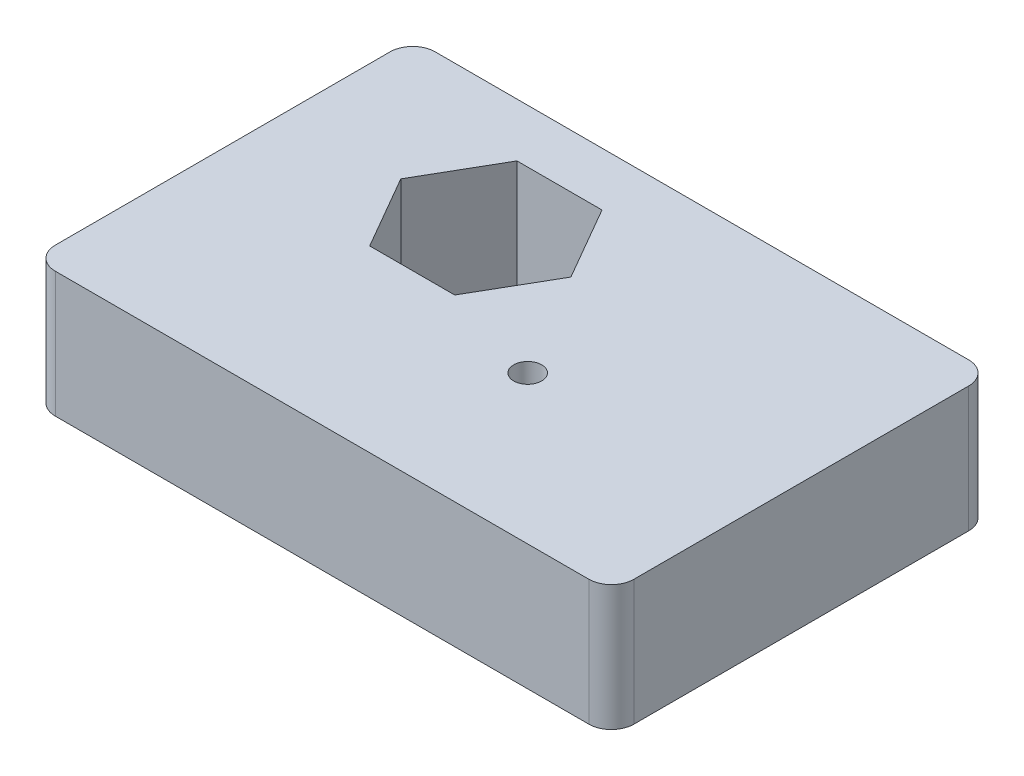
ISO-10303-21;
HEADER;
FILE_DESCRIPTION(('STEP AP214'),'2;1');
FILE_NAME('part.step','',(''),(''),'','','');
FILE_SCHEMA(('AUTOMOTIVE_DESIGN { 1 0 10303 214 1 1 1 1 }'));
ENDSEC;
DATA;
#1=APPLICATION_CONTEXT('core data for automotive mechanical design processes');
#2=APPLICATION_PROTOCOL_DEFINITION('international standard','automotive_design',2000,#1);
#3=PRODUCT_CONTEXT('',#1,'mechanical');
#4=PRODUCT('Part','Part','',(#3));
#5=PRODUCT_RELATED_PRODUCT_CATEGORY('part','',(#4));
#6=PRODUCT_DEFINITION_FORMATION('','',#4);
#7=PRODUCT_DEFINITION_CONTEXT('part definition',#1,'design');
#8=PRODUCT_DEFINITION('design','',#6,#7);
#9=PRODUCT_DEFINITION_SHAPE('','',#8);
#10=(LENGTH_UNIT() NAMED_UNIT(*) SI_UNIT(.MILLI.,.METRE.));
#11=(NAMED_UNIT(*) PLANE_ANGLE_UNIT() SI_UNIT($,.RADIAN.));
#12=(NAMED_UNIT(*) SI_UNIT($,.STERADIAN.) SOLID_ANGLE_UNIT());
#13=UNCERTAINTY_MEASURE_WITH_UNIT(LENGTH_MEASURE(1.E-05),#10,'distance_accuracy_value','');
#14=(GEOMETRIC_REPRESENTATION_CONTEXT(3) GLOBAL_UNCERTAINTY_ASSIGNED_CONTEXT((#13)) GLOBAL_UNIT_ASSIGNED_CONTEXT((#10,
#11,#12)) REPRESENTATION_CONTEXT('',''));
#15=CARTESIAN_POINT('',(0.,0.,0.));
#16=DIRECTION('',(0.,0.,1.));
#17=DIRECTION('',(1.,0.,0.));
#18=AXIS2_PLACEMENT_3D('',#15,#16,#17);
#19=CARTESIAN_POINT('',(0.,6.,0.));
#20=DIRECTION('',(0.,-1.,0.));
#21=DIRECTION('',(0.,0.,-1.));
#22=AXIS2_PLACEMENT_3D('',#19,#20,#21);
#23=PLANE('',#22);
#24=CARTESIAN_POINT('',(16.5,6.,-7.));
#25=DIRECTION('',(0.,-1.,0.));
#26=DIRECTION('',(0.,0.,-1.));
#27=AXIS2_PLACEMENT_3D('',#24,#25,#26);
#28=CIRCLE('',#27,0.670000000000002);
#29=CARTESIAN_POINT('',(16.5,6.,-7.67));
#30=VERTEX_POINT('',#29);
#31=EDGE_CURVE('E206',#30,#30,#28,.F.);
#32=ORIENTED_EDGE('',*,*,#31,.F.);
#33=EDGE_LOOP('',(#32));
#34=FACE_BOUND('',#33,.T.);
#35=DIRECTION('',(0.,0.,1.));
#36=VECTOR('',#35,1.);
#37=CARTESIAN_POINT('',(-0.08,6.,0.));
#38=LINE('',#37,#36);
#39=CARTESIAN_POINT('',(-0.08,6.,-17.));
#40=VERTEX_POINT('',#39);
#41=CARTESIAN_POINT('',(-0.08,6.,-1.));
#42=VERTEX_POINT('',#41);
#43=EDGE_CURVE('E200',#40,#42,#38,.T.);
#44=ORIENTED_EDGE('',*,*,#43,.T.);
#45=CARTESIAN_POINT('',(1.,6.,-1.));
#46=DIRECTION('',(0.,-1.,0.));
#47=DIRECTION('',(0.,0.,-1.));
#48=AXIS2_PLACEMENT_3D('',#45,#46,#47);
#49=CIRCLE('',#48,1.08);
#50=CARTESIAN_POINT('',(1.,6.,0.08));
#51=VERTEX_POINT('',#50);
#52=EDGE_CURVE('E217',#42,#51,#49,.F.);
#53=ORIENTED_EDGE('',*,*,#52,.T.);
#54=DIRECTION('',(1.,0.,0.));
#55=VECTOR('',#54,1.);
#56=CARTESIAN_POINT('',(0.,6.,0.08));
#57=LINE('',#56,#55);
#58=CARTESIAN_POINT('',(26.5,6.,0.08));
#59=VERTEX_POINT('',#58);
#60=EDGE_CURVE('E213',#51,#59,#57,.T.);
#61=ORIENTED_EDGE('',*,*,#60,.T.);
#62=CARTESIAN_POINT('',(26.5,6.,-1.));
#63=DIRECTION('',(0.,-1.,0.));
#64=DIRECTION('',(0.,0.,-1.));
#65=AXIS2_PLACEMENT_3D('',#62,#63,#64);
#66=CIRCLE('',#65,1.08);
#67=CARTESIAN_POINT('',(27.58,6.,-1.));
#68=VERTEX_POINT('',#67);
#69=EDGE_CURVE('E229',#59,#68,#66,.F.);
#70=ORIENTED_EDGE('',*,*,#69,.T.);
#71=DIRECTION('',(0.,0.,-1.));
#72=VECTOR('',#71,1.);
#73=CARTESIAN_POINT('',(27.58,6.,0.));
#74=LINE('',#73,#72);
#75=CARTESIAN_POINT('',(27.58,6.,-17.));
#76=VERTEX_POINT('',#75);
#77=EDGE_CURVE('E216',#68,#76,#74,.T.);
#78=ORIENTED_EDGE('',*,*,#77,.T.);
#79=CARTESIAN_POINT('',(26.5,6.,-17.));
#80=DIRECTION('',(0.,-1.,0.));
#81=DIRECTION('',(0.,0.,-1.));
#82=AXIS2_PLACEMENT_3D('',#79,#80,#81);
#83=CIRCLE('',#82,1.08);
#84=CARTESIAN_POINT('',(26.5,6.,-18.08));
#85=VERTEX_POINT('',#84);
#86=EDGE_CURVE('E224',#76,#85,#83,.F.);
#87=ORIENTED_EDGE('',*,*,#86,.T.);
#88=DIRECTION('',(-1.,0.,0.));
#89=VECTOR('',#88,1.);
#90=CARTESIAN_POINT('',(0.,6.,-18.08));
#91=LINE('',#90,#89);
#92=CARTESIAN_POINT('',(1.,6.,-18.08));
#93=VERTEX_POINT('',#92);
#94=EDGE_CURVE('E225',#85,#93,#91,.T.);
#95=ORIENTED_EDGE('',*,*,#94,.T.);
#96=CARTESIAN_POINT('',(1.,6.,-17.));
#97=DIRECTION('',(0.,-1.,0.));
#98=DIRECTION('',(0.,0.,-1.));
#99=AXIS2_PLACEMENT_3D('',#96,#97,#98);
#100=CIRCLE('',#99,1.08);
#101=EDGE_CURVE('E220',#93,#40,#100,.F.);
#102=ORIENTED_EDGE('',*,*,#101,.T.);
#103=EDGE_LOOP('',(#44,#53,#61,#70,#78,#87,#95,#102));
#104=FACE_BOUND('',#103,.T.);
#105=DIRECTION('',(0.5,0.,-0.866025403784439));
#106=VECTOR('',#105,1.);
#107=CARTESIAN_POINT('',(4.97725699861459,6.,2.87362066797608));
#108=LINE('',#107,#106);
#109=CARTESIAN_POINT('',(11.5322729475475,6.,-8.48));
#110=VERTEX_POINT('',#109);
#111=CARTESIAN_POINT('',(13.564545895095,6.,-12.));
#112=VERTEX_POINT('',#111);
#113=EDGE_CURVE('E145',#110,#112,#108,.T.);
#114=ORIENTED_EDGE('',*,*,#113,.F.);
#115=DIRECTION('',(1.,0.,0.));
#116=VECTOR('',#115,1.);
#117=CARTESIAN_POINT('',(0.,6.,-8.48));
#118=LINE('',#117,#116);
#119=CARTESIAN_POINT('',(7.46772705245251,6.,-8.48));
#120=VERTEX_POINT('',#119);
#121=EDGE_CURVE('E160',#120,#110,#118,.T.);
#122=ORIENTED_EDGE('',*,*,#121,.F.);
#123=DIRECTION('',(0.5,0.,0.866025403784439));
#124=VECTOR('',#123,1.);
#125=CARTESIAN_POINT('',(9.2727430013854,6.,-5.35362066797608));
#126=LINE('',#125,#124);
#127=CARTESIAN_POINT('',(5.43545410490503,6.,-12.));
#128=VERTEX_POINT('',#127);
#129=EDGE_CURVE('E156',#128,#120,#126,.T.);
#130=ORIENTED_EDGE('',*,*,#129,.F.);
#131=DIRECTION('',(-0.5,0.,0.866025403784439));
#132=VECTOR('',#131,1.);
#133=CARTESIAN_POINT('',(-1.11956184402786,6.,-0.646379332023917));
#134=LINE('',#133,#132);
#135=CARTESIAN_POINT('',(7.46772705245252,6.,-15.52));
#136=VERTEX_POINT('',#135);
#137=EDGE_CURVE('E155',#136,#128,#134,.T.);
#138=ORIENTED_EDGE('',*,*,#137,.F.);
#139=DIRECTION('',(-1.,0.,0.));
#140=VECTOR('',#139,1.);
#141=CARTESIAN_POINT('',(0.,6.,-15.52));
#142=LINE('',#141,#140);
#143=CARTESIAN_POINT('',(11.5322729475475,6.,-15.52));
#144=VERTEX_POINT('',#143);
#145=EDGE_CURVE('E39',#144,#136,#142,.T.);
#146=ORIENTED_EDGE('',*,*,#145,.F.);
#147=DIRECTION('',(-0.5,0.,-0.866025403784439));
#148=VECTOR('',#147,1.);
#149=CARTESIAN_POINT('',(15.3695618440279,6.,-8.87362066797607));
#150=LINE('',#149,#148);
#151=EDGE_CURVE('E137',#112,#144,#150,.T.);
#152=ORIENTED_EDGE('',*,*,#151,.F.);
#153=EDGE_LOOP('',(#114,#122,#130,#138,#146,#152));
#154=FACE_BOUND('',#153,.T.);
#155=ADVANCED_FACE('F35',(#34,#104,#154),#23,.F.);
#156=CARTESIAN_POINT('',(0.,0.,0.));
#157=DIRECTION('',(0.,-1.,0.));
#158=DIRECTION('',(0.,0.,-1.));
#159=AXIS2_PLACEMENT_3D('',#156,#157,#158);
#160=PLANE('',#159);
#161=CARTESIAN_POINT('',(16.5,0.,-7.));
#162=DIRECTION('',(0.,-1.,0.));
#163=DIRECTION('',(0.,0.,-1.));
#164=AXIS2_PLACEMENT_3D('',#161,#162,#163);
#165=CIRCLE('',#164,0.670000000000002);
#166=CARTESIAN_POINT('',(16.5,0.,-7.67));
#167=VERTEX_POINT('',#166);
#168=EDGE_CURVE('E189',#167,#167,#165,.F.);
#169=ORIENTED_EDGE('',*,*,#168,.T.);
#170=EDGE_LOOP('',(#169));
#171=FACE_BOUND('',#170,.T.);
#172=DIRECTION('',(1.,0.,0.));
#173=VECTOR('',#172,1.);
#174=CARTESIAN_POINT('',(0.,0.,0.08));
#175=LINE('',#174,#173);
#176=CARTESIAN_POINT('',(1.,0.,0.08));
#177=VERTEX_POINT('',#176);
#178=CARTESIAN_POINT('',(26.5,0.,0.08));
#179=VERTEX_POINT('',#178);
#180=EDGE_CURVE('E194',#177,#179,#175,.T.);
#181=ORIENTED_EDGE('',*,*,#180,.F.);
#182=CARTESIAN_POINT('',(1.,0.,-1.));
#183=DIRECTION('',(0.,-1.,0.));
#184=DIRECTION('',(0.,0.,-1.));
#185=AXIS2_PLACEMENT_3D('',#182,#183,#184);
#186=CIRCLE('',#185,1.08);
#187=CARTESIAN_POINT('',(-0.08,0.,-1.));
#188=VERTEX_POINT('',#187);
#189=EDGE_CURVE('E202',#177,#188,#186,.T.);
#190=ORIENTED_EDGE('',*,*,#189,.T.);
#191=DIRECTION('',(0.,0.,1.));
#192=VECTOR('',#191,1.);
#193=CARTESIAN_POINT('',(-0.08,0.,0.));
#194=LINE('',#193,#192);
#195=CARTESIAN_POINT('',(-0.08,0.,-17.));
#196=VERTEX_POINT('',#195);
#197=EDGE_CURVE('E203',#196,#188,#194,.T.);
#198=ORIENTED_EDGE('',*,*,#197,.F.);
#199=CARTESIAN_POINT('',(1.,0.,-17.));
#200=DIRECTION('',(0.,-1.,0.));
#201=DIRECTION('',(0.,0.,-1.));
#202=AXIS2_PLACEMENT_3D('',#199,#200,#201);
#203=CIRCLE('',#202,1.08);
#204=CARTESIAN_POINT('',(1.,0.,-18.08));
#205=VERTEX_POINT('',#204);
#206=EDGE_CURVE('E197',#196,#205,#203,.T.);
#207=ORIENTED_EDGE('',*,*,#206,.T.);
#208=DIRECTION('',(-1.,0.,0.));
#209=VECTOR('',#208,1.);
#210=CARTESIAN_POINT('',(0.,0.,-18.08));
#211=LINE('',#210,#209);
#212=CARTESIAN_POINT('',(26.5,0.,-18.08));
#213=VERTEX_POINT('',#212);
#214=EDGE_CURVE('E193',#213,#205,#211,.T.);
#215=ORIENTED_EDGE('',*,*,#214,.F.);
#216=CARTESIAN_POINT('',(26.5,0.,-17.));
#217=DIRECTION('',(0.,-1.,0.));
#218=DIRECTION('',(0.,0.,-1.));
#219=AXIS2_PLACEMENT_3D('',#216,#217,#218);
#220=CIRCLE('',#219,1.08);
#221=CARTESIAN_POINT('',(27.58,0.,-17.));
#222=VERTEX_POINT('',#221);
#223=EDGE_CURVE('E195',#213,#222,#220,.T.);
#224=ORIENTED_EDGE('',*,*,#223,.T.);
#225=DIRECTION('',(0.,0.,-1.));
#226=VECTOR('',#225,1.);
#227=CARTESIAN_POINT('',(27.58,0.,0.));
#228=LINE('',#227,#226);
#229=CARTESIAN_POINT('',(27.58,0.,-1.));
#230=VERTEX_POINT('',#229);
#231=EDGE_CURVE('E190',#230,#222,#228,.T.);
#232=ORIENTED_EDGE('',*,*,#231,.F.);
#233=CARTESIAN_POINT('',(26.5,0.,-1.));
#234=DIRECTION('',(0.,-1.,0.));
#235=DIRECTION('',(0.,0.,-1.));
#236=AXIS2_PLACEMENT_3D('',#233,#234,#235);
#237=CIRCLE('',#236,1.08);
#238=EDGE_CURVE('E198',#230,#179,#237,.T.);
#239=ORIENTED_EDGE('',*,*,#238,.T.);
#240=EDGE_LOOP('',(#181,#190,#198,#207,#215,#224,#232,#239));
#241=FACE_BOUND('',#240,.T.);
#242=DIRECTION('',(1.,0.,0.));
#243=VECTOR('',#242,1.);
#244=CARTESIAN_POINT('',(0.,0.,-8.48));
#245=LINE('',#244,#243);
#246=CARTESIAN_POINT('',(7.46772705245251,0.,-8.48));
#247=VERTEX_POINT('',#246);
#248=CARTESIAN_POINT('',(11.5322729475475,0.,-8.48));
#249=VERTEX_POINT('',#248);
#250=EDGE_CURVE('E165',#247,#249,#245,.T.);
#251=ORIENTED_EDGE('',*,*,#250,.T.);
#252=DIRECTION('',(0.5,0.,-0.866025403784439));
#253=VECTOR('',#252,1.);
#254=CARTESIAN_POINT('',(4.97725699861459,0.,2.87362066797608));
#255=LINE('',#254,#253);
#256=CARTESIAN_POINT('',(13.564545895095,0.,-12.));
#257=VERTEX_POINT('',#256);
#258=EDGE_CURVE('E167',#249,#257,#255,.T.);
#259=ORIENTED_EDGE('',*,*,#258,.T.);
#260=DIRECTION('',(-0.5,0.,-0.866025403784439));
#261=VECTOR('',#260,1.);
#262=CARTESIAN_POINT('',(15.3695618440279,0.,-8.87362066797607));
#263=LINE('',#262,#261);
#264=CARTESIAN_POINT('',(11.5322729475475,0.,-15.52));
#265=VERTEX_POINT('',#264);
#266=EDGE_CURVE('E170',#257,#265,#263,.T.);
#267=ORIENTED_EDGE('',*,*,#266,.T.);
#268=DIRECTION('',(-1.,0.,0.));
#269=VECTOR('',#268,1.);
#270=CARTESIAN_POINT('',(0.,0.,-15.52));
#271=LINE('',#270,#269);
#272=CARTESIAN_POINT('',(7.46772705245252,0.,-15.52));
#273=VERTEX_POINT('',#272);
#274=EDGE_CURVE('E149',#265,#273,#271,.T.);
#275=ORIENTED_EDGE('',*,*,#274,.T.);
#276=DIRECTION('',(-0.5,0.,0.866025403784439));
#277=VECTOR('',#276,1.);
#278=CARTESIAN_POINT('',(-1.11956184402786,0.,-0.646379332023917));
#279=LINE('',#278,#277);
#280=CARTESIAN_POINT('',(5.43545410490503,0.,-12.));
#281=VERTEX_POINT('',#280);
#282=EDGE_CURVE('E176',#273,#281,#279,.T.);
#283=ORIENTED_EDGE('',*,*,#282,.T.);
#284=DIRECTION('',(0.5,0.,0.866025403784439));
#285=VECTOR('',#284,1.);
#286=CARTESIAN_POINT('',(9.2727430013854,0.,-5.35362066797608));
#287=LINE('',#286,#285);
#288=EDGE_CURVE('E173',#281,#247,#287,.T.);
#289=ORIENTED_EDGE('',*,*,#288,.T.);
#290=EDGE_LOOP('',(#251,#259,#267,#275,#283,#289));
#291=FACE_BOUND('',#290,.T.);
#292=ADVANCED_FACE('F256',(#171,#241,#291),#160,.T.);
#293=CARTESIAN_POINT('',(-0.08,6.,0.));
#294=DIRECTION('',(1.,0.,0.));
#295=DIRECTION('',(0.,0.,-1.));
#296=AXIS2_PLACEMENT_3D('',#293,#294,#295);
#297=PLANE('',#296);
#298=ORIENTED_EDGE('',*,*,#197,.T.);
#299=DIRECTION('',(0.,1.,0.));
#300=VECTOR('',#299,1.);
#301=CARTESIAN_POINT('',(-0.08,6.,-1.));
#302=LINE('',#301,#300);
#303=EDGE_CURVE('E234',#188,#42,#302,.T.);
#304=ORIENTED_EDGE('',*,*,#303,.T.);
#305=ORIENTED_EDGE('',*,*,#43,.F.);
#306=DIRECTION('',(0.,1.,0.));
#307=VECTOR('',#306,1.);
#308=CARTESIAN_POINT('',(-0.08,6.,-17.));
#309=LINE('',#308,#307);
#310=EDGE_CURVE('E208',#40,#196,#309,.F.);
#311=ORIENTED_EDGE('',*,*,#310,.T.);
#312=EDGE_LOOP('',(#298,#304,#305,#311));
#313=FACE_BOUND('',#312,.T.);
#314=ADVANCED_FACE('F293',(#313),#297,.F.);
#315=CARTESIAN_POINT('',(0.,6.,0.08));
#316=DIRECTION('',(0.,0.,-1.));
#317=DIRECTION('',(-1.,0.,0.));
#318=AXIS2_PLACEMENT_3D('',#315,#316,#317);
#319=PLANE('',#318);
#320=ORIENTED_EDGE('',*,*,#60,.F.);
#321=DIRECTION('',(0.,1.,0.));
#322=VECTOR('',#321,1.);
#323=CARTESIAN_POINT('',(1.,6.,0.08));
#324=LINE('',#323,#322);
#325=EDGE_CURVE('E212',#51,#177,#324,.F.);
#326=ORIENTED_EDGE('',*,*,#325,.T.);
#327=ORIENTED_EDGE('',*,*,#180,.T.);
#328=DIRECTION('',(0.,1.,0.));
#329=VECTOR('',#328,1.);
#330=CARTESIAN_POINT('',(26.5,6.,0.08));
#331=LINE('',#330,#329);
#332=EDGE_CURVE('E227',#179,#59,#331,.T.);
#333=ORIENTED_EDGE('',*,*,#332,.T.);
#334=EDGE_LOOP('',(#320,#326,#327,#333));
#335=FACE_BOUND('',#334,.T.);
#336=ADVANCED_FACE('F270',(#335),#319,.F.);
#337=CARTESIAN_POINT('',(27.58,6.,0.));
#338=DIRECTION('',(-1.,0.,0.));
#339=DIRECTION('',(0.,0.,1.));
#340=AXIS2_PLACEMENT_3D('',#337,#338,#339);
#341=PLANE('',#340);
#342=ORIENTED_EDGE('',*,*,#231,.T.);
#343=DIRECTION('',(0.,1.,0.));
#344=VECTOR('',#343,1.);
#345=CARTESIAN_POINT('',(27.58,6.,-17.));
#346=LINE('',#345,#344);
#347=EDGE_CURVE('E12',#222,#76,#346,.T.);
#348=ORIENTED_EDGE('',*,*,#347,.T.);
#349=ORIENTED_EDGE('',*,*,#77,.F.);
#350=DIRECTION('',(0.,1.,0.));
#351=VECTOR('',#350,1.);
#352=CARTESIAN_POINT('',(27.58,6.,-1.));
#353=LINE('',#352,#351);
#354=EDGE_CURVE('E45',#68,#230,#353,.F.);
#355=ORIENTED_EDGE('',*,*,#354,.T.);
#356=EDGE_LOOP('',(#342,#348,#349,#355));
#357=FACE_BOUND('',#356,.T.);
#358=ADVANCED_FACE('F282',(#357),#341,.F.);
#359=CARTESIAN_POINT('',(0.,6.,-18.08));
#360=DIRECTION('',(0.,0.,1.));
#361=DIRECTION('',(1.,0.,0.));
#362=AXIS2_PLACEMENT_3D('',#359,#360,#361);
#363=PLANE('',#362);
#364=ORIENTED_EDGE('',*,*,#214,.T.);
#365=DIRECTION('',(0.,1.,0.));
#366=VECTOR('',#365,1.);
#367=CARTESIAN_POINT('',(1.,6.,-18.08));
#368=LINE('',#367,#366);
#369=EDGE_CURVE('E54',#205,#93,#368,.T.);
#370=ORIENTED_EDGE('',*,*,#369,.T.);
#371=ORIENTED_EDGE('',*,*,#94,.F.);
#372=DIRECTION('',(0.,1.,0.));
#373=VECTOR('',#372,1.);
#374=CARTESIAN_POINT('',(26.5,6.,-18.08));
#375=LINE('',#374,#373);
#376=EDGE_CURVE('E219',#85,#213,#375,.F.);
#377=ORIENTED_EDGE('',*,*,#376,.T.);
#378=EDGE_LOOP('',(#364,#370,#371,#377));
#379=FACE_BOUND('',#378,.T.);
#380=ADVANCED_FACE('F290',(#379),#363,.F.);
#381=CARTESIAN_POINT('',(16.5,6.,-7.));
#382=DIRECTION('',(0.,-1.,0.));
#383=DIRECTION('',(0.,0.,-1.));
#384=AXIS2_PLACEMENT_3D('',#381,#382,#383);
#385=CYLINDRICAL_SURFACE('',#384,0.670000000000002);
#386=ORIENTED_EDGE('',*,*,#31,.T.);
#387=EDGE_LOOP('',(#386));
#388=FACE_BOUND('',#387,.T.);
#389=ORIENTED_EDGE('',*,*,#168,.F.);
#390=EDGE_LOOP('',(#389));
#391=FACE_BOUND('',#390,.T.);
#392=ADVANCED_FACE('F251',(#388,#391),#385,.F.);
#393=CARTESIAN_POINT('',(11.5091789367799,6.,-8.44));
#394=DIRECTION('',(-0.866025403784438,0.,-0.5));
#395=DIRECTION('',(-0.5,0.,0.866025403784439));
#396=AXIS2_PLACEMENT_3D('',#393,#394,#395);
#397=PLANE('',#396);
#398=ORIENTED_EDGE('',*,*,#258,.F.);
#399=DIRECTION('',(0.,-1.,0.));
#400=VECTOR('',#399,1.);
#401=CARTESIAN_POINT('',(11.5322729475475,6.,-8.48));
#402=LINE('',#401,#400);
#403=EDGE_CURVE('E164',#110,#249,#402,.T.);
#404=ORIENTED_EDGE('',*,*,#403,.F.);
#405=ORIENTED_EDGE('',*,*,#113,.T.);
#406=DIRECTION('',(0.,-1.,0.));
#407=VECTOR('',#406,1.);
#408=CARTESIAN_POINT('',(13.564545895095,6.,-12.));
#409=LINE('',#408,#407);
#410=EDGE_CURVE('E142',#112,#257,#409,.T.);
#411=ORIENTED_EDGE('',*,*,#410,.T.);
#412=EDGE_LOOP('',(#398,#404,#405,#411));
#413=FACE_BOUND('',#412,.T.);
#414=ADVANCED_FACE('F37',(#413),#397,.T.);
#415=CARTESIAN_POINT('',(13.5876399058625,6.,-11.96));
#416=DIRECTION('',(-0.866025403784439,0.,0.5));
#417=DIRECTION('',(0.5,0.,0.866025403784439));
#418=AXIS2_PLACEMENT_3D('',#415,#416,#417);
#419=PLANE('',#418);
#420=ORIENTED_EDGE('',*,*,#266,.F.);
#421=ORIENTED_EDGE('',*,*,#410,.F.);
#422=ORIENTED_EDGE('',*,*,#151,.T.);
#423=DIRECTION('',(0.,-1.,0.));
#424=VECTOR('',#423,1.);
#425=CARTESIAN_POINT('',(11.5322729475475,6.,-15.52));
#426=LINE('',#425,#424);
#427=EDGE_CURVE('E139',#144,#265,#426,.T.);
#428=ORIENTED_EDGE('',*,*,#427,.T.);
#429=EDGE_LOOP('',(#420,#421,#422,#428));
#430=FACE_BOUND('',#429,.T.);
#431=ADVANCED_FACE('F138',(#430),#419,.T.);
#432=CARTESIAN_POINT('',(11.5784609690826,6.,-15.52));
#433=DIRECTION('',(0.,0.,1.));
#434=DIRECTION('',(1.,0.,0.));
#435=AXIS2_PLACEMENT_3D('',#432,#433,#434);
#436=PLANE('',#435);
#437=ORIENTED_EDGE('',*,*,#274,.F.);
#438=ORIENTED_EDGE('',*,*,#427,.F.);
#439=ORIENTED_EDGE('',*,*,#145,.T.);
#440=DIRECTION('',(0.,-1.,0.));
#441=VECTOR('',#440,1.);
#442=CARTESIAN_POINT('',(7.46772705245252,6.,-15.52));
#443=LINE('',#442,#441);
#444=EDGE_CURVE('E151',#136,#273,#443,.T.);
#445=ORIENTED_EDGE('',*,*,#444,.T.);
#446=EDGE_LOOP('',(#437,#438,#439,#445));
#447=FACE_BOUND('',#446,.T.);
#448=ADVANCED_FACE('F147',(#447),#436,.T.);
#449=CARTESIAN_POINT('',(7.4908210632201,6.,-15.56));
#450=DIRECTION('',(0.866025403784439,0.,0.5));
#451=DIRECTION('',(0.5,0.,-0.866025403784439));
#452=AXIS2_PLACEMENT_3D('',#449,#450,#451);
#453=PLANE('',#452);
#454=ORIENTED_EDGE('',*,*,#282,.F.);
#455=ORIENTED_EDGE('',*,*,#444,.F.);
#456=ORIENTED_EDGE('',*,*,#137,.T.);
#457=DIRECTION('',(0.,-1.,0.));
#458=VECTOR('',#457,1.);
#459=CARTESIAN_POINT('',(5.43545410490503,6.,-12.));
#460=LINE('',#459,#458);
#461=EDGE_CURVE('E185',#128,#281,#460,.T.);
#462=ORIENTED_EDGE('',*,*,#461,.T.);
#463=EDGE_LOOP('',(#454,#455,#456,#462));
#464=FACE_BOUND('',#463,.T.);
#465=ADVANCED_FACE('F309',(#464),#453,.T.);
#466=CARTESIAN_POINT('',(5.41236009413745,6.,-12.04));
#467=DIRECTION('',(0.866025403784439,0.,-0.5));
#468=DIRECTION('',(-0.5,0.,-0.866025403784439));
#469=AXIS2_PLACEMENT_3D('',#466,#467,#468);
#470=PLANE('',#469);
#471=ORIENTED_EDGE('',*,*,#288,.F.);
#472=ORIENTED_EDGE('',*,*,#461,.F.);
#473=ORIENTED_EDGE('',*,*,#129,.T.);
#474=DIRECTION('',(0.,-1.,0.));
#475=VECTOR('',#474,1.);
#476=CARTESIAN_POINT('',(7.46772705245251,6.,-8.48));
#477=LINE('',#476,#475);
#478=EDGE_CURVE('E183',#120,#247,#477,.T.);
#479=ORIENTED_EDGE('',*,*,#478,.T.);
#480=EDGE_LOOP('',(#471,#472,#473,#479));
#481=FACE_BOUND('',#480,.T.);
#482=ADVANCED_FACE('F312',(#481),#470,.T.);
#483=CARTESIAN_POINT('',(7.42153903091734,6.,-8.48));
#484=DIRECTION('',(0.,0.,-1.));
#485=DIRECTION('',(-1.,0.,0.));
#486=AXIS2_PLACEMENT_3D('',#483,#484,#485);
#487=PLANE('',#486);
#488=ORIENTED_EDGE('',*,*,#250,.F.);
#489=ORIENTED_EDGE('',*,*,#478,.F.);
#490=ORIENTED_EDGE('',*,*,#121,.T.);
#491=ORIENTED_EDGE('',*,*,#403,.T.);
#492=EDGE_LOOP('',(#488,#489,#490,#491));
#493=FACE_BOUND('',#492,.T.);
#494=ADVANCED_FACE('F307',(#493),#487,.T.);
#495=CARTESIAN_POINT('',(1.,6.,-1.));
#496=DIRECTION('',(0.,-1.,0.));
#497=DIRECTION('',(0.,0.,-1.));
#498=AXIS2_PLACEMENT_3D('',#495,#496,#497);
#499=CYLINDRICAL_SURFACE('',#498,1.08);
#500=ORIENTED_EDGE('',*,*,#52,.F.);
#501=ORIENTED_EDGE('',*,*,#303,.F.);
#502=ORIENTED_EDGE('',*,*,#189,.F.);
#503=ORIENTED_EDGE('',*,*,#325,.F.);
#504=EDGE_LOOP('',(#500,#501,#502,#503));
#505=FACE_BOUND('',#504,.T.);
#506=ADVANCED_FACE('F267',(#505),#499,.T.);
#507=CARTESIAN_POINT('',(1.,6.,-17.));
#508=DIRECTION('',(0.,-1.,0.));
#509=DIRECTION('',(0.,0.,-1.));
#510=AXIS2_PLACEMENT_3D('',#507,#508,#509);
#511=CYLINDRICAL_SURFACE('',#510,1.08);
#512=ORIENTED_EDGE('',*,*,#101,.F.);
#513=ORIENTED_EDGE('',*,*,#369,.F.);
#514=ORIENTED_EDGE('',*,*,#206,.F.);
#515=ORIENTED_EDGE('',*,*,#310,.F.);
#516=EDGE_LOOP('',(#512,#513,#514,#515));
#517=FACE_BOUND('',#516,.T.);
#518=ADVANCED_FACE('F292',(#517),#511,.T.);
#519=CARTESIAN_POINT('',(26.5,6.,-17.));
#520=DIRECTION('',(0.,-1.,0.));
#521=DIRECTION('',(0.,0.,-1.));
#522=AXIS2_PLACEMENT_3D('',#519,#520,#521);
#523=CYLINDRICAL_SURFACE('',#522,1.08);
#524=ORIENTED_EDGE('',*,*,#86,.F.);
#525=ORIENTED_EDGE('',*,*,#347,.F.);
#526=ORIENTED_EDGE('',*,*,#223,.F.);
#527=ORIENTED_EDGE('',*,*,#376,.F.);
#528=EDGE_LOOP('',(#524,#525,#526,#527));
#529=FACE_BOUND('',#528,.T.);
#530=ADVANCED_FACE('F288',(#529),#523,.T.);
#531=CARTESIAN_POINT('',(26.5,6.,-1.));
#532=DIRECTION('',(0.,-1.,0.));
#533=DIRECTION('',(0.,0.,-1.));
#534=AXIS2_PLACEMENT_3D('',#531,#532,#533);
#535=CYLINDRICAL_SURFACE('',#534,1.08);
#536=ORIENTED_EDGE('',*,*,#69,.F.);
#537=ORIENTED_EDGE('',*,*,#332,.F.);
#538=ORIENTED_EDGE('',*,*,#238,.F.);
#539=ORIENTED_EDGE('',*,*,#354,.F.);
#540=EDGE_LOOP('',(#536,#537,#538,#539));
#541=FACE_BOUND('',#540,.T.);
#542=ADVANCED_FACE('F279',(#541),#535,.T.);
#543=CLOSED_SHELL('',(#155,#292,#314,#336,#358,#380,#392,#414,#431,#448,#465,#482,#494,#506,
#518,#530,#542));
#544=MANIFOLD_SOLID_BREP('B2',#543);
#545=ADVANCED_BREP_SHAPE_REPRESENTATION('',(#18,#544),#14);
#546=SHAPE_DEFINITION_REPRESENTATION(#9,#545);
ENDSEC;
END-ISO-10303-21;
